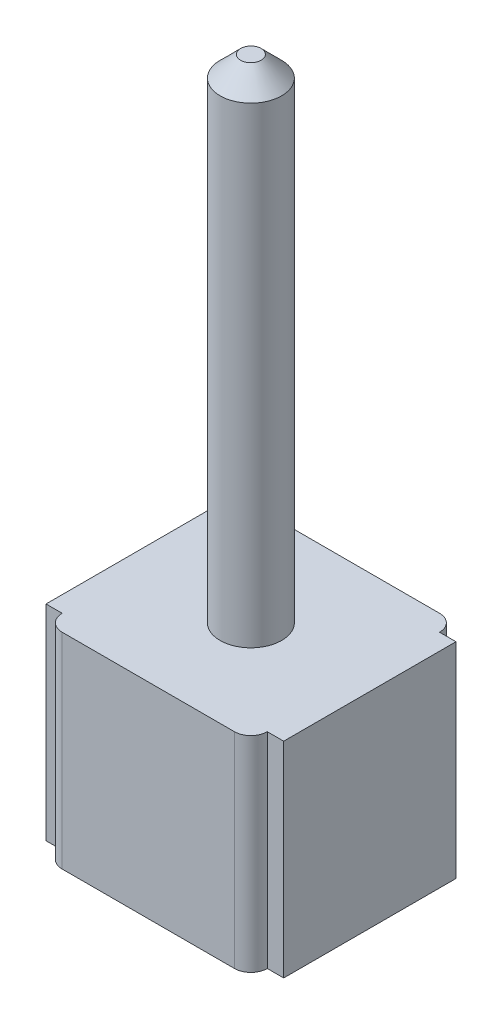
ISO-10303-21;
HEADER;
FILE_DESCRIPTION(('STEP AP214'),'2;1');
FILE_NAME('part.step','',(''),(''),'','','');
FILE_SCHEMA(('AUTOMOTIVE_DESIGN { 1 0 10303 214 1 1 1 1 }'));
ENDSEC;
DATA;
#1=APPLICATION_CONTEXT('core data for automotive mechanical design processes');
#2=APPLICATION_PROTOCOL_DEFINITION('international standard','automotive_design',2000,#1);
#3=PRODUCT_CONTEXT('',#1,'mechanical');
#4=PRODUCT('Part','Part','',(#3));
#5=PRODUCT_RELATED_PRODUCT_CATEGORY('part','',(#4));
#6=PRODUCT_DEFINITION_FORMATION('','',#4);
#7=PRODUCT_DEFINITION_CONTEXT('part definition',#1,'design');
#8=PRODUCT_DEFINITION('design','',#6,#7);
#9=PRODUCT_DEFINITION_SHAPE('','',#8);
#10=(LENGTH_UNIT() NAMED_UNIT(*) SI_UNIT(.MILLI.,.METRE.));
#11=(NAMED_UNIT(*) PLANE_ANGLE_UNIT() SI_UNIT($,.RADIAN.));
#12=(NAMED_UNIT(*) SI_UNIT($,.STERADIAN.) SOLID_ANGLE_UNIT());
#13=UNCERTAINTY_MEASURE_WITH_UNIT(LENGTH_MEASURE(1.E-05),#10,'distance_accuracy_value','');
#14=(GEOMETRIC_REPRESENTATION_CONTEXT(3) GLOBAL_UNCERTAINTY_ASSIGNED_CONTEXT((#13)) GLOBAL_UNIT_ASSIGNED_CONTEXT((#10,
#11,#12)) REPRESENTATION_CONTEXT('',''));
#15=CARTESIAN_POINT('',(0.,0.,0.));
#16=DIRECTION('',(0.,0.,1.));
#17=DIRECTION('',(1.,0.,0.));
#18=AXIS2_PLACEMENT_3D('',#15,#16,#17);
#19=CARTESIAN_POINT('',(-1.05,2.5,-1.05));
#20=DIRECTION('',(0.,-1.,0.));
#21=DIRECTION('',(0.,0.,-1.));
#22=AXIS2_PLACEMENT_3D('',#19,#20,#21);
#23=CYLINDRICAL_SURFACE('',#22,0.2);
#24=CARTESIAN_POINT('',(-1.05,0.,-1.05));
#25=DIRECTION('',(0.,1.,0.));
#26=DIRECTION('',(0.,0.,-1.));
#27=AXIS2_PLACEMENT_3D('',#24,#25,#26);
#28=CIRCLE('',#27,0.2);
#29=CARTESIAN_POINT('',(-1.05,0.,-1.25));
#30=VERTEX_POINT('',#29);
#31=CARTESIAN_POINT('',(-1.25,0.,-1.05));
#32=VERTEX_POINT('',#31);
#33=EDGE_CURVE('E213',#30,#32,#28,.T.);
#34=ORIENTED_EDGE('',*,*,#33,.T.);
#35=DIRECTION('',(0.,-1.,0.));
#36=VECTOR('',#35,1.);
#37=CARTESIAN_POINT('',(-1.25,2.5,-1.05));
#38=LINE('',#37,#36);
#39=CARTESIAN_POINT('',(-1.25,2.5,-1.05));
#40=VERTEX_POINT('',#39);
#41=EDGE_CURVE('E304',#40,#32,#38,.T.);
#42=ORIENTED_EDGE('',*,*,#41,.F.);
#43=CARTESIAN_POINT('',(-1.05,2.5,-1.05));
#44=DIRECTION('',(0.,1.,0.));
#45=DIRECTION('',(0.,0.,-1.));
#46=AXIS2_PLACEMENT_3D('',#43,#44,#45);
#47=CIRCLE('',#46,0.2);
#48=CARTESIAN_POINT('',(-1.05,2.5,-1.25));
#49=VERTEX_POINT('',#48);
#50=EDGE_CURVE('E222',#49,#40,#47,.T.);
#51=ORIENTED_EDGE('',*,*,#50,.F.);
#52=DIRECTION('',(0.,-1.,0.));
#53=VECTOR('',#52,1.);
#54=CARTESIAN_POINT('',(-1.05,2.5,-1.25));
#55=LINE('',#54,#53);
#56=EDGE_CURVE('E247',#49,#30,#55,.T.);
#57=ORIENTED_EDGE('',*,*,#56,.T.);
#58=EDGE_LOOP('',(#34,#42,#51,#57));
#59=FACE_BOUND('',#58,.T.);
#60=ADVANCED_FACE('F37',(#59),#23,.T.);
#61=CARTESIAN_POINT('',(-1.25,2.5,-1.05));
#62=DIRECTION('',(0.,0.,1.));
#63=DIRECTION('',(1.,0.,0.));
#64=AXIS2_PLACEMENT_3D('',#61,#62,#63);
#65=PLANE('',#64);
#66=DIRECTION('',(-1.,0.,0.));
#67=VECTOR('',#66,1.);
#68=CARTESIAN_POINT('',(-1.25,0.,-1.05));
#69=LINE('',#68,#67);
#70=CARTESIAN_POINT('',(-1.44693131321162,0.,-1.05));
#71=VERTEX_POINT('',#70);
#72=EDGE_CURVE('E217',#32,#71,#69,.T.);
#73=ORIENTED_EDGE('',*,*,#72,.T.);
#74=DIRECTION('',(0.,-1.,0.));
#75=VECTOR('',#74,1.);
#76=CARTESIAN_POINT('',(-1.44693131321162,2.5,-1.05));
#77=LINE('',#76,#75);
#78=CARTESIAN_POINT('',(-1.44693131321162,2.5,-1.05));
#79=VERTEX_POINT('',#78);
#80=EDGE_CURVE('E301',#79,#71,#77,.T.);
#81=ORIENTED_EDGE('',*,*,#80,.F.);
#82=DIRECTION('',(-1.,0.,0.));
#83=VECTOR('',#82,1.);
#84=CARTESIAN_POINT('',(-1.25,2.5,-1.05));
#85=LINE('',#84,#83);
#86=EDGE_CURVE('E225',#40,#79,#85,.T.);
#87=ORIENTED_EDGE('',*,*,#86,.F.);
#88=ORIENTED_EDGE('',*,*,#41,.T.);
#89=EDGE_LOOP('',(#73,#81,#87,#88));
#90=FACE_BOUND('',#89,.T.);
#91=ADVANCED_FACE('F430',(#90),#65,.F.);
#92=CARTESIAN_POINT('',(-1.44693131321162,2.5,-1.05));
#93=DIRECTION('',(1.,0.,0.));
#94=DIRECTION('',(0.,0.,-1.));
#95=AXIS2_PLACEMENT_3D('',#92,#93,#94);
#96=PLANE('',#95);
#97=DIRECTION('',(0.,0.,1.));
#98=VECTOR('',#97,1.);
#99=CARTESIAN_POINT('',(-1.44693131321162,0.,-1.05));
#100=LINE('',#99,#98);
#101=CARTESIAN_POINT('',(-1.44693131321162,0.,1.05));
#102=VERTEX_POINT('',#101);
#103=EDGE_CURVE('E250',#71,#102,#100,.T.);
#104=ORIENTED_EDGE('',*,*,#103,.T.);
#105=DIRECTION('',(0.,-1.,0.));
#106=VECTOR('',#105,1.);
#107=CARTESIAN_POINT('',(-1.44693131321162,2.5,1.05));
#108=LINE('',#107,#106);
#109=CARTESIAN_POINT('',(-1.44693131321162,2.5,1.05));
#110=VERTEX_POINT('',#109);
#111=EDGE_CURVE('E298',#110,#102,#108,.T.);
#112=ORIENTED_EDGE('',*,*,#111,.F.);
#113=DIRECTION('',(0.,0.,1.));
#114=VECTOR('',#113,1.);
#115=CARTESIAN_POINT('',(-1.44693131321162,2.5,-1.05));
#116=LINE('',#115,#114);
#117=EDGE_CURVE('E228',#79,#110,#116,.T.);
#118=ORIENTED_EDGE('',*,*,#117,.F.);
#119=ORIENTED_EDGE('',*,*,#80,.T.);
#120=EDGE_LOOP('',(#104,#112,#118,#119));
#121=FACE_BOUND('',#120,.T.);
#122=ADVANCED_FACE('F427',(#121),#96,.F.);
#123=CARTESIAN_POINT('',(-1.44693131321162,2.5,1.05));
#124=DIRECTION('',(0.,0.,-1.));
#125=DIRECTION('',(-1.,0.,0.));
#126=AXIS2_PLACEMENT_3D('',#123,#124,#125);
#127=PLANE('',#126);
#128=DIRECTION('',(1.,0.,0.));
#129=VECTOR('',#128,1.);
#130=CARTESIAN_POINT('',(-1.44693131321162,0.,1.05));
#131=LINE('',#130,#129);
#132=CARTESIAN_POINT('',(-1.25,0.,1.05));
#133=VERTEX_POINT('',#132);
#134=EDGE_CURVE('E252',#102,#133,#131,.T.);
#135=ORIENTED_EDGE('',*,*,#134,.T.);
#136=DIRECTION('',(0.,-1.,0.));
#137=VECTOR('',#136,1.);
#138=CARTESIAN_POINT('',(-1.25,2.5,1.05));
#139=LINE('',#138,#137);
#140=CARTESIAN_POINT('',(-1.25,2.5,1.05));
#141=VERTEX_POINT('',#140);
#142=EDGE_CURVE('E295',#141,#133,#139,.T.);
#143=ORIENTED_EDGE('',*,*,#142,.F.);
#144=DIRECTION('',(1.,0.,0.));
#145=VECTOR('',#144,1.);
#146=CARTESIAN_POINT('',(-1.44693131321162,2.5,1.05));
#147=LINE('',#146,#145);
#148=EDGE_CURVE('E230',#110,#141,#147,.T.);
#149=ORIENTED_EDGE('',*,*,#148,.F.);
#150=ORIENTED_EDGE('',*,*,#111,.T.);
#151=EDGE_LOOP('',(#135,#143,#149,#150));
#152=FACE_BOUND('',#151,.T.);
#153=ADVANCED_FACE('F422',(#152),#127,.F.);
#154=CARTESIAN_POINT('',(-1.05,2.5,1.05));
#155=DIRECTION('',(0.,-1.,0.));
#156=DIRECTION('',(0.,0.,-1.));
#157=AXIS2_PLACEMENT_3D('',#154,#155,#156);
#158=CYLINDRICAL_SURFACE('',#157,0.2);
#159=CARTESIAN_POINT('',(-1.05,0.,1.05));
#160=DIRECTION('',(0.,1.,0.));
#161=DIRECTION('',(0.,0.,-1.));
#162=AXIS2_PLACEMENT_3D('',#159,#160,#161);
#163=CIRCLE('',#162,0.2);
#164=CARTESIAN_POINT('',(-1.05,0.,1.25));
#165=VERTEX_POINT('',#164);
#166=EDGE_CURVE('E254',#133,#165,#163,.T.);
#167=ORIENTED_EDGE('',*,*,#166,.T.);
#168=DIRECTION('',(0.,-1.,0.));
#169=VECTOR('',#168,1.);
#170=CARTESIAN_POINT('',(-1.05,2.5,1.25));
#171=LINE('',#170,#169);
#172=CARTESIAN_POINT('',(-1.05,2.5,1.25));
#173=VERTEX_POINT('',#172);
#174=EDGE_CURVE('E292',#173,#165,#171,.T.);
#175=ORIENTED_EDGE('',*,*,#174,.F.);
#176=CARTESIAN_POINT('',(-1.05,2.5,1.05));
#177=DIRECTION('',(0.,1.,0.));
#178=DIRECTION('',(0.,0.,-1.));
#179=AXIS2_PLACEMENT_3D('',#176,#177,#178);
#180=CIRCLE('',#179,0.2);
#181=EDGE_CURVE('E232',#141,#173,#180,.T.);
#182=ORIENTED_EDGE('',*,*,#181,.F.);
#183=ORIENTED_EDGE('',*,*,#142,.T.);
#184=EDGE_LOOP('',(#167,#175,#182,#183));
#185=FACE_BOUND('',#184,.T.);
#186=ADVANCED_FACE('F417',(#185),#158,.T.);
#187=CARTESIAN_POINT('',(-1.05,2.5,1.25));
#188=DIRECTION('',(0.,0.,-1.));
#189=DIRECTION('',(-1.,0.,0.));
#190=AXIS2_PLACEMENT_3D('',#187,#188,#189);
#191=PLANE('',#190);
#192=DIRECTION('',(1.,0.,0.));
#193=VECTOR('',#192,1.);
#194=CARTESIAN_POINT('',(-1.05,0.,1.25));
#195=LINE('',#194,#193);
#196=CARTESIAN_POINT('',(1.05,0.,1.25));
#197=VERTEX_POINT('',#196);
#198=EDGE_CURVE('E256',#165,#197,#195,.T.);
#199=ORIENTED_EDGE('',*,*,#198,.T.);
#200=DIRECTION('',(0.,-1.,0.));
#201=VECTOR('',#200,1.);
#202=CARTESIAN_POINT('',(1.05,2.5,1.25));
#203=LINE('',#202,#201);
#204=CARTESIAN_POINT('',(1.05,2.5,1.25));
#205=VERTEX_POINT('',#204);
#206=EDGE_CURVE('E289',#205,#197,#203,.T.);
#207=ORIENTED_EDGE('',*,*,#206,.F.);
#208=DIRECTION('',(1.,0.,0.));
#209=VECTOR('',#208,1.);
#210=CARTESIAN_POINT('',(-1.05,2.5,1.25));
#211=LINE('',#210,#209);
#212=EDGE_CURVE('E234',#173,#205,#211,.T.);
#213=ORIENTED_EDGE('',*,*,#212,.F.);
#214=ORIENTED_EDGE('',*,*,#174,.T.);
#215=EDGE_LOOP('',(#199,#207,#213,#214));
#216=FACE_BOUND('',#215,.T.);
#217=ADVANCED_FACE('F413',(#216),#191,.F.);
#218=CARTESIAN_POINT('',(1.05,2.5,1.05));
#219=DIRECTION('',(0.,-1.,0.));
#220=DIRECTION('',(0.,0.,-1.));
#221=AXIS2_PLACEMENT_3D('',#218,#219,#220);
#222=CYLINDRICAL_SURFACE('',#221,0.2);
#223=CARTESIAN_POINT('',(1.05,0.,1.05));
#224=DIRECTION('',(0.,1.,0.));
#225=DIRECTION('',(0.,0.,1.));
#226=AXIS2_PLACEMENT_3D('',#223,#224,#225);
#227=CIRCLE('',#226,0.2);
#228=CARTESIAN_POINT('',(1.25,0.,1.05));
#229=VERTEX_POINT('',#228);
#230=EDGE_CURVE('E258',#197,#229,#227,.T.);
#231=ORIENTED_EDGE('',*,*,#230,.T.);
#232=DIRECTION('',(0.,-1.,0.));
#233=VECTOR('',#232,1.);
#234=CARTESIAN_POINT('',(1.25,2.5,1.05));
#235=LINE('',#234,#233);
#236=CARTESIAN_POINT('',(1.25,2.5,1.05));
#237=VERTEX_POINT('',#236);
#238=EDGE_CURVE('E286',#237,#229,#235,.T.);
#239=ORIENTED_EDGE('',*,*,#238,.F.);
#240=CARTESIAN_POINT('',(1.05,2.5,1.05));
#241=DIRECTION('',(0.,1.,0.));
#242=DIRECTION('',(0.,0.,1.));
#243=AXIS2_PLACEMENT_3D('',#240,#241,#242);
#244=CIRCLE('',#243,0.2);
#245=EDGE_CURVE('E236',#205,#237,#244,.T.);
#246=ORIENTED_EDGE('',*,*,#245,.F.);
#247=ORIENTED_EDGE('',*,*,#206,.T.);
#248=EDGE_LOOP('',(#231,#239,#246,#247));
#249=FACE_BOUND('',#248,.T.);
#250=ADVANCED_FACE('F408',(#249),#222,.T.);
#251=CARTESIAN_POINT('',(1.44996260874723,2.5,1.05));
#252=DIRECTION('',(0.,0.,-1.));
#253=DIRECTION('',(-1.,0.,0.));
#254=AXIS2_PLACEMENT_3D('',#251,#252,#253);
#255=PLANE('',#254);
#256=DIRECTION('',(1.,0.,0.));
#257=VECTOR('',#256,1.);
#258=CARTESIAN_POINT('',(1.44996260874723,0.,1.05));
#259=LINE('',#258,#257);
#260=CARTESIAN_POINT('',(1.44996260874723,0.,1.05));
#261=VERTEX_POINT('',#260);
#262=EDGE_CURVE('E260',#229,#261,#259,.T.);
#263=ORIENTED_EDGE('',*,*,#262,.T.);
#264=DIRECTION('',(0.,-1.,0.));
#265=VECTOR('',#264,1.);
#266=CARTESIAN_POINT('',(1.44996260874723,2.5,1.05));
#267=LINE('',#266,#265);
#268=CARTESIAN_POINT('',(1.44996260874723,2.5,1.05));
#269=VERTEX_POINT('',#268);
#270=EDGE_CURVE('E283',#269,#261,#267,.T.);
#271=ORIENTED_EDGE('',*,*,#270,.F.);
#272=DIRECTION('',(1.,0.,0.));
#273=VECTOR('',#272,1.);
#274=CARTESIAN_POINT('',(1.44996260874723,2.5,1.05));
#275=LINE('',#274,#273);
#276=EDGE_CURVE('E238',#237,#269,#275,.T.);
#277=ORIENTED_EDGE('',*,*,#276,.F.);
#278=ORIENTED_EDGE('',*,*,#238,.T.);
#279=EDGE_LOOP('',(#263,#271,#277,#278));
#280=FACE_BOUND('',#279,.T.);
#281=ADVANCED_FACE('F402',(#280),#255,.F.);
#282=CARTESIAN_POINT('',(1.44996260874723,2.5,-1.05));
#283=DIRECTION('',(-1.,0.,0.));
#284=DIRECTION('',(0.,0.,1.));
#285=AXIS2_PLACEMENT_3D('',#282,#283,#284);
#286=PLANE('',#285);
#287=DIRECTION('',(0.,0.,-1.));
#288=VECTOR('',#287,1.);
#289=CARTESIAN_POINT('',(1.44996260874723,0.,-1.05));
#290=LINE('',#289,#288);
#291=CARTESIAN_POINT('',(1.44996260874723,0.,-1.05));
#292=VERTEX_POINT('',#291);
#293=EDGE_CURVE('E262',#261,#292,#290,.T.);
#294=ORIENTED_EDGE('',*,*,#293,.T.);
#295=DIRECTION('',(0.,-1.,0.));
#296=VECTOR('',#295,1.);
#297=CARTESIAN_POINT('',(1.44996260874723,2.5,-1.05));
#298=LINE('',#297,#296);
#299=CARTESIAN_POINT('',(1.44996260874723,2.5,-1.05));
#300=VERTEX_POINT('',#299);
#301=EDGE_CURVE('E280',#300,#292,#298,.T.);
#302=ORIENTED_EDGE('',*,*,#301,.F.);
#303=DIRECTION('',(0.,0.,-1.));
#304=VECTOR('',#303,1.);
#305=CARTESIAN_POINT('',(1.44996260874723,2.5,-1.05));
#306=LINE('',#305,#304);
#307=EDGE_CURVE('E240',#269,#300,#306,.T.);
#308=ORIENTED_EDGE('',*,*,#307,.F.);
#309=ORIENTED_EDGE('',*,*,#270,.T.);
#310=EDGE_LOOP('',(#294,#302,#308,#309));
#311=FACE_BOUND('',#310,.T.);
#312=ADVANCED_FACE('F398',(#311),#286,.F.);
#313=CARTESIAN_POINT('',(1.25,2.5,-1.05));
#314=DIRECTION('',(0.,0.,1.));
#315=DIRECTION('',(1.,0.,0.));
#316=AXIS2_PLACEMENT_3D('',#313,#314,#315);
#317=PLANE('',#316);
#318=DIRECTION('',(-1.,0.,0.));
#319=VECTOR('',#318,1.);
#320=CARTESIAN_POINT('',(1.25,0.,-1.05));
#321=LINE('',#320,#319);
#322=CARTESIAN_POINT('',(1.25,0.,-1.05));
#323=VERTEX_POINT('',#322);
#324=EDGE_CURVE('E264',#292,#323,#321,.T.);
#325=ORIENTED_EDGE('',*,*,#324,.T.);
#326=DIRECTION('',(0.,-1.,0.));
#327=VECTOR('',#326,1.);
#328=CARTESIAN_POINT('',(1.25,2.5,-1.05));
#329=LINE('',#328,#327);
#330=CARTESIAN_POINT('',(1.25,2.5,-1.05));
#331=VERTEX_POINT('',#330);
#332=EDGE_CURVE('E277',#331,#323,#329,.T.);
#333=ORIENTED_EDGE('',*,*,#332,.F.);
#334=DIRECTION('',(-1.,0.,0.));
#335=VECTOR('',#334,1.);
#336=CARTESIAN_POINT('',(1.25,2.5,-1.05));
#337=LINE('',#336,#335);
#338=EDGE_CURVE('E242',#300,#331,#337,.T.);
#339=ORIENTED_EDGE('',*,*,#338,.F.);
#340=ORIENTED_EDGE('',*,*,#301,.T.);
#341=EDGE_LOOP('',(#325,#333,#339,#340));
#342=FACE_BOUND('',#341,.T.);
#343=ADVANCED_FACE('F393',(#342),#317,.F.);
#344=CARTESIAN_POINT('',(1.05,2.5,-1.05));
#345=DIRECTION('',(0.,-1.,0.));
#346=DIRECTION('',(0.,0.,-1.));
#347=AXIS2_PLACEMENT_3D('',#344,#345,#346);
#348=CYLINDRICAL_SURFACE('',#347,0.2);
#349=CARTESIAN_POINT('',(1.05,0.,-1.05));
#350=DIRECTION('',(0.,1.,0.));
#351=DIRECTION('',(0.,0.,-1.));
#352=AXIS2_PLACEMENT_3D('',#349,#350,#351);
#353=CIRCLE('',#352,0.2);
#354=CARTESIAN_POINT('',(1.05,0.,-1.25));
#355=VERTEX_POINT('',#354);
#356=EDGE_CURVE('E266',#323,#355,#353,.T.);
#357=ORIENTED_EDGE('',*,*,#356,.T.);
#358=DIRECTION('',(0.,-1.,0.));
#359=VECTOR('',#358,1.);
#360=CARTESIAN_POINT('',(1.05,2.5,-1.25));
#361=LINE('',#360,#359);
#362=CARTESIAN_POINT('',(1.05,2.5,-1.25));
#363=VERTEX_POINT('',#362);
#364=EDGE_CURVE('E274',#363,#355,#361,.T.);
#365=ORIENTED_EDGE('',*,*,#364,.F.);
#366=CARTESIAN_POINT('',(1.05,2.5,-1.05));
#367=DIRECTION('',(0.,1.,0.));
#368=DIRECTION('',(0.,0.,-1.));
#369=AXIS2_PLACEMENT_3D('',#366,#367,#368);
#370=CIRCLE('',#369,0.2);
#371=EDGE_CURVE('E244',#331,#363,#370,.T.);
#372=ORIENTED_EDGE('',*,*,#371,.F.);
#373=ORIENTED_EDGE('',*,*,#332,.T.);
#374=EDGE_LOOP('',(#357,#365,#372,#373));
#375=FACE_BOUND('',#374,.T.);
#376=ADVANCED_FACE('F387',(#375),#348,.T.);
#377=CARTESIAN_POINT('',(-1.05,2.5,-1.25));
#378=DIRECTION('',(0.,0.,1.));
#379=DIRECTION('',(1.,0.,0.));
#380=AXIS2_PLACEMENT_3D('',#377,#378,#379);
#381=PLANE('',#380);
#382=DIRECTION('',(-1.,0.,0.));
#383=VECTOR('',#382,1.);
#384=CARTESIAN_POINT('',(-1.05,0.,-1.25));
#385=LINE('',#384,#383);
#386=CARTESIAN_POINT('',(0.304241831659743,0.,-1.25));
#387=VERTEX_POINT('',#386);
#388=EDGE_CURVE('E226',#355,#387,#385,.T.);
#389=ORIENTED_EDGE('',*,*,#388,.T.);
#390=DIRECTION('',(0.,1.,0.));
#391=VECTOR('',#390,1.);
#392=CARTESIAN_POINT('',(0.304241831659743,-0.2,-1.25));
#393=LINE('',#392,#391);
#394=CARTESIAN_POINT('',(0.304241831659743,-0.15,-1.25));
#395=VERTEX_POINT('',#394);
#396=EDGE_CURVE('E335',#395,#387,#393,.T.);
#397=ORIENTED_EDGE('',*,*,#396,.F.);
#398=CARTESIAN_POINT('',(0.154241831659743,-0.15,-1.25));
#399=DIRECTION('',(0.,0.,1.));
#400=DIRECTION('',(1.,0.,0.));
#401=AXIS2_PLACEMENT_3D('',#398,#399,#400);
#402=CIRCLE('',#401,0.15);
#403=CARTESIAN_POINT('',(0.154241831659743,0.,-1.25));
#404=VERTEX_POINT('',#403);
#405=EDGE_CURVE('E11',#395,#404,#402,.T.);
#406=ORIENTED_EDGE('',*,*,#405,.T.);
#407=CARTESIAN_POINT('',(-0.149312937150452,0.,-1.25));
#408=VERTEX_POINT('',#407);
#409=EDGE_CURVE('E271',#404,#408,#385,.T.);
#410=ORIENTED_EDGE('',*,*,#409,.T.);
#411=CARTESIAN_POINT('',(-0.149312937150452,-0.15,-1.25));
#412=DIRECTION('',(0.,0.,1.));
#413=DIRECTION('',(1.,0.,0.));
#414=AXIS2_PLACEMENT_3D('',#411,#412,#413);
#415=CIRCLE('',#414,0.15);
#416=CARTESIAN_POINT('',(-0.299312937150452,-0.15,-1.25));
#417=VERTEX_POINT('',#416);
#418=EDGE_CURVE('E46',#408,#417,#415,.T.);
#419=ORIENTED_EDGE('',*,*,#418,.T.);
#420=DIRECTION('',(0.,-1.,0.));
#421=VECTOR('',#420,1.);
#422=CARTESIAN_POINT('',(-0.299312937150452,-0.2,-1.25));
#423=LINE('',#422,#421);
#424=CARTESIAN_POINT('',(-0.299312937150452,0.,-1.25));
#425=VERTEX_POINT('',#424);
#426=EDGE_CURVE('E54',#425,#417,#423,.T.);
#427=ORIENTED_EDGE('',*,*,#426,.F.);
#428=EDGE_CURVE('E268',#425,#30,#385,.T.);
#429=ORIENTED_EDGE('',*,*,#428,.T.);
#430=ORIENTED_EDGE('',*,*,#56,.F.);
#431=DIRECTION('',(-1.,0.,0.));
#432=VECTOR('',#431,1.);
#433=CARTESIAN_POINT('',(-1.05,2.5,-1.25));
#434=LINE('',#433,#432);
#435=EDGE_CURVE('E246',#363,#49,#434,.T.);
#436=ORIENTED_EDGE('',*,*,#435,.F.);
#437=ORIENTED_EDGE('',*,*,#364,.T.);
#438=EDGE_LOOP('',(#389,#397,#406,#410,#419,#427,#429,#430,#436,#437));
#439=FACE_BOUND('',#438,.T.);
#440=ADVANCED_FACE('F381',(#439),#381,.F.);
#441=CARTESIAN_POINT('',(-1.05,2.5,-1.05));
#442=DIRECTION('',(0.,-1.,0.));
#443=DIRECTION('',(0.,0.,-1.));
#444=AXIS2_PLACEMENT_3D('',#441,#442,#443);
#445=PLANE('',#444);
#446=CARTESIAN_POINT('',(0.,2.5,0.));
#447=DIRECTION('',(0.,-1.,0.));
#448=DIRECTION('',(0.,0.,-1.));
#449=AXIS2_PLACEMENT_3D('',#446,#447,#448);
#450=CIRCLE('',#449,0.375);
#451=CARTESIAN_POINT('',(0.,2.5,-0.375));
#452=VERTEX_POINT('',#451);
#453=EDGE_CURVE('E307',#452,#452,#450,.F.);
#454=ORIENTED_EDGE('',*,*,#453,.F.);
#455=EDGE_LOOP('',(#454));
#456=FACE_BOUND('',#455,.T.);
#457=ORIENTED_EDGE('',*,*,#50,.T.);
#458=ORIENTED_EDGE('',*,*,#86,.T.);
#459=ORIENTED_EDGE('',*,*,#117,.T.);
#460=ORIENTED_EDGE('',*,*,#148,.T.);
#461=ORIENTED_EDGE('',*,*,#181,.T.);
#462=ORIENTED_EDGE('',*,*,#212,.T.);
#463=ORIENTED_EDGE('',*,*,#245,.T.);
#464=ORIENTED_EDGE('',*,*,#276,.T.);
#465=ORIENTED_EDGE('',*,*,#307,.T.);
#466=ORIENTED_EDGE('',*,*,#338,.T.);
#467=ORIENTED_EDGE('',*,*,#371,.T.);
#468=ORIENTED_EDGE('',*,*,#435,.T.);
#469=EDGE_LOOP('',(#457,#458,#459,#460,#461,#462,#463,#464,#465,#466,#467,#468));
#470=FACE_BOUND('',#469,.T.);
#471=ADVANCED_FACE('F587',(#456,#470),#445,.F.);
#472=CARTESIAN_POINT('',(-1.05,0.,-1.05));
#473=DIRECTION('',(0.,-1.,0.));
#474=DIRECTION('',(0.,0.,-1.));
#475=AXIS2_PLACEMENT_3D('',#472,#473,#474);
#476=PLANE('',#475);
#477=DIRECTION('',(0.,0.,-1.));
#478=VECTOR('',#477,1.);
#479=CARTESIAN_POINT('',(-0.299312937150452,0.,0.));
#480=LINE('',#479,#478);
#481=CARTESIAN_POINT('',(-0.299312937150452,0.,0.));
#482=VERTEX_POINT('',#481);
#483=EDGE_CURVE('E353',#482,#425,#480,.T.);
#484=ORIENTED_EDGE('',*,*,#483,.F.);
#485=DIRECTION('',(-1.,0.,0.));
#486=VECTOR('',#485,1.);
#487=CARTESIAN_POINT('',(0.,0.,0.));
#488=LINE('',#487,#486);
#489=CARTESIAN_POINT('',(0.304241831659743,0.,0.));
#490=VERTEX_POINT('',#489);
#491=EDGE_CURVE('E209',#490,#482,#488,.T.);
#492=ORIENTED_EDGE('',*,*,#491,.F.);
#493=DIRECTION('',(0.,0.,1.));
#494=VECTOR('',#493,1.);
#495=CARTESIAN_POINT('',(0.304241831659743,0.,0.));
#496=LINE('',#495,#494);
#497=EDGE_CURVE('E316',#387,#490,#496,.T.);
#498=ORIENTED_EDGE('',*,*,#497,.F.);
#499=ORIENTED_EDGE('',*,*,#388,.F.);
#500=ORIENTED_EDGE('',*,*,#356,.F.);
#501=ORIENTED_EDGE('',*,*,#324,.F.);
#502=ORIENTED_EDGE('',*,*,#293,.F.);
#503=ORIENTED_EDGE('',*,*,#262,.F.);
#504=ORIENTED_EDGE('',*,*,#230,.F.);
#505=ORIENTED_EDGE('',*,*,#198,.F.);
#506=ORIENTED_EDGE('',*,*,#166,.F.);
#507=ORIENTED_EDGE('',*,*,#134,.F.);
#508=ORIENTED_EDGE('',*,*,#103,.F.);
#509=ORIENTED_EDGE('',*,*,#72,.F.);
#510=ORIENTED_EDGE('',*,*,#33,.F.);
#511=ORIENTED_EDGE('',*,*,#428,.F.);
#512=EDGE_LOOP('',(#484,#492,#498,#499,#500,#501,#502,#503,#504,#505,#506,#507,#508,#509,#510,#511));
#513=FACE_BOUND('',#512,.T.);
#514=ADVANCED_FACE('F379',(#513),#476,.T.);
#515=CARTESIAN_POINT('',(0.,8.5,0.));
#516=DIRECTION('',(0.,-1.,0.));
#517=DIRECTION('',(0.,0.,-1.));
#518=AXIS2_PLACEMENT_3D('',#515,#516,#517);
#519=CYLINDRICAL_SURFACE('',#518,0.375);
#520=CARTESIAN_POINT('',(0.,8.25,0.));
#521=DIRECTION('',(0.,1.,0.));
#522=DIRECTION('',(0.,0.,1.));
#523=AXIS2_PLACEMENT_3D('',#520,#521,#522);
#524=CIRCLE('',#523,0.375);
#525=CARTESIAN_POINT('',(0.,8.25,-0.375000000000001));
#526=VERTEX_POINT('',#525);
#527=EDGE_CURVE('E313',#526,#526,#524,.F.);
#528=ORIENTED_EDGE('',*,*,#527,.T.);
#529=EDGE_LOOP('',(#528));
#530=FACE_BOUND('',#529,.T.);
#531=ORIENTED_EDGE('',*,*,#453,.T.);
#532=EDGE_LOOP('',(#531));
#533=FACE_BOUND('',#532,.T.);
#534=ADVANCED_FACE('F627',(#530,#533),#519,.T.);
#535=CARTESIAN_POINT('',(0.,8.5,0.));
#536=DIRECTION('',(0.,1.,0.));
#537=DIRECTION('',(0.,0.,1.));
#538=AXIS2_PLACEMENT_3D('',#535,#536,#537);
#539=PLANE('',#538);
#540=CARTESIAN_POINT('',(0.,8.5,0.));
#541=DIRECTION('',(0.,1.,0.));
#542=DIRECTION('',(0.,0.,1.));
#543=AXIS2_PLACEMENT_3D('',#540,#541,#542);
#544=CIRCLE('',#543,0.124999999999998);
#545=CARTESIAN_POINT('',(0.,8.5,-0.124999999999999));
#546=VERTEX_POINT('',#545);
#547=EDGE_CURVE('E310',#546,#546,#544,.T.);
#548=ORIENTED_EDGE('',*,*,#547,.T.);
#549=EDGE_LOOP('',(#548));
#550=FACE_BOUND('',#549,.T.);
#551=ADVANCED_FACE('F477',(#550),#539,.T.);
#552=CARTESIAN_POINT('',(0.,8.5,0.));
#553=DIRECTION('',(0.,-1.,0.));
#554=DIRECTION('',(0.,0.,-1.));
#555=AXIS2_PLACEMENT_3D('',#552,#553,#554);
#556=CONICAL_SURFACE('',#555,0.124999999999998,0.785398163397448);
#557=CARTESIAN_POINT('',(0.,8.25,-0.375000000000001));
#558=CARTESIAN_POINT('',(0.,8.25260416666666,-0.372395833333334));
#559=CARTESIAN_POINT('',(0.,8.25520833333333,-0.369791666666667));
#560=CARTESIAN_POINT('',(0.,8.26041666666666,-0.364583333333334));
#561=CARTESIAN_POINT('',(0.,8.26302083333333,-0.361979166666668));
#562=CARTESIAN_POINT('',(0.,8.26822916666666,-0.356770833333334));
#563=CARTESIAN_POINT('',(0.,8.27083333333333,-0.354166666666667));
#564=CARTESIAN_POINT('',(0.,8.27604166666666,-0.348958333333334));
#565=CARTESIAN_POINT('',(0.,8.27864583333333,-0.346354166666668));
#566=CARTESIAN_POINT('',(0.,8.28385416666666,-0.341145833333334));
#567=CARTESIAN_POINT('',(0.,8.28645833333333,-0.338541666666667));
#568=CARTESIAN_POINT('',(0.,8.29166666666666,-0.333333333333334));
#569=CARTESIAN_POINT('',(0.,8.29427083333333,-0.330729166666667));
#570=CARTESIAN_POINT('',(0.,8.29947916666666,-0.325520833333334));
#571=CARTESIAN_POINT('',(0.,8.30208333333333,-0.322916666666667));
#572=CARTESIAN_POINT('',(0.,8.30729166666666,-0.317708333333334));
#573=CARTESIAN_POINT('',(0.,8.30989583333333,-0.315104166666667));
#574=CARTESIAN_POINT('',(0.,8.31510416666666,-0.309895833333334));
#575=CARTESIAN_POINT('',(0.,8.31770833333333,-0.307291666666667));
#576=CARTESIAN_POINT('',(0.,8.32291666666666,-0.302083333333334));
#577=CARTESIAN_POINT('',(0.,8.32552083333333,-0.299479166666667));
#578=CARTESIAN_POINT('',(0.,8.33072916666666,-0.294270833333334));
#579=CARTESIAN_POINT('',(0.,8.33333333333333,-0.291666666666667));
#580=CARTESIAN_POINT('',(0.,8.33854166666666,-0.286458333333334));
#581=CARTESIAN_POINT('',(0.,8.34114583333333,-0.283854166666667));
#582=CARTESIAN_POINT('',(0.,8.34635416666666,-0.278645833333334));
#583=CARTESIAN_POINT('',(0.,8.34895833333333,-0.276041666666667));
#584=CARTESIAN_POINT('',(0.,8.35416666666666,-0.270833333333333));
#585=CARTESIAN_POINT('',(0.,8.35677083333333,-0.268229166666667));
#586=CARTESIAN_POINT('',(0.,8.36197916666666,-0.263020833333334));
#587=CARTESIAN_POINT('',(0.,8.36458333333333,-0.260416666666667));
#588=CARTESIAN_POINT('',(0.,8.36979166666666,-0.255208333333333));
#589=CARTESIAN_POINT('',(0.,8.37239583333333,-0.252604166666667));
#590=CARTESIAN_POINT('',(0.,8.37760416666666,-0.247395833333334));
#591=CARTESIAN_POINT('',(0.,8.38020833333333,-0.244791666666667));
#592=CARTESIAN_POINT('',(0.,8.38541666666667,-0.239583333333333));
#593=CARTESIAN_POINT('',(0.,8.38802083333333,-0.236979166666667));
#594=CARTESIAN_POINT('',(0.,8.39322916666666,-0.231770833333333));
#595=CARTESIAN_POINT('',(0.,8.39583333333333,-0.229166666666667));
#596=CARTESIAN_POINT('',(0.,8.40104166666667,-0.223958333333333));
#597=CARTESIAN_POINT('',(0.,8.40364583333333,-0.221354166666666));
#598=CARTESIAN_POINT('',(0.,8.40885416666666,-0.216145833333333));
#599=CARTESIAN_POINT('',(0.,8.41145833333333,-0.213541666666667));
#600=CARTESIAN_POINT('',(0.,8.41666666666667,-0.208333333333333));
#601=CARTESIAN_POINT('',(0.,8.41927083333333,-0.205729166666666));
#602=CARTESIAN_POINT('',(0.,8.42447916666666,-0.200520833333333));
#603=CARTESIAN_POINT('',(0.,8.42708333333333,-0.197916666666667));
#604=CARTESIAN_POINT('',(0.,8.43229166666667,-0.192708333333333));
#605=CARTESIAN_POINT('',(0.,8.43489583333333,-0.190104166666666));
#606=CARTESIAN_POINT('',(0.,8.44010416666667,-0.184895833333333));
#607=CARTESIAN_POINT('',(0.,8.44270833333333,-0.182291666666666));
#608=CARTESIAN_POINT('',(0.,8.44791666666667,-0.177083333333333));
#609=CARTESIAN_POINT('',(0.,8.45052083333333,-0.174479166666666));
#610=CARTESIAN_POINT('',(0.,8.45572916666667,-0.169270833333333));
#611=CARTESIAN_POINT('',(0.,8.45833333333333,-0.166666666666666));
#612=CARTESIAN_POINT('',(0.,8.46354166666667,-0.161458333333333));
#613=CARTESIAN_POINT('',(0.,8.46614583333333,-0.158854166666666));
#614=CARTESIAN_POINT('',(0.,8.47135416666667,-0.153645833333333));
#615=CARTESIAN_POINT('',(0.,8.47395833333333,-0.151041666666666));
#616=CARTESIAN_POINT('',(0.,8.47916666666667,-0.145833333333333));
#617=CARTESIAN_POINT('',(0.,8.48177083333333,-0.143229166666666));
#618=CARTESIAN_POINT('',(0.,8.48697916666667,-0.138020833333332));
#619=CARTESIAN_POINT('',(0.,8.48958333333333,-0.135416666666666));
#620=CARTESIAN_POINT('',(0.,8.49479166666667,-0.130208333333333));
#621=CARTESIAN_POINT('',(0.,8.49739583333333,-0.127604166666666));
#622=CARTESIAN_POINT('',(0.,8.5,-0.124999999999999));
#623=B_SPLINE_CURVE_WITH_KNOTS('',3,(#557,#558,#559,#560,#561,#562,#563,#564,#565,#566,#567,
#568,#569,#570,#571,#572,#573,#574,#575,#576,#577,#578,#579,#580,#581,#582,#583,#584,#585,#586,
#587,#588,#589,#590,#591,#592,#593,#594,#595,#596,#597,#598,#599,#600,#601,#602,#603,#604,#605,
#606,#607,#608,#609,#610,#611,#612,#613,#614,#615,#616,#617,#618,#619,#620,#621,#622),
.UNSPECIFIED.,.F.,.F.,(4,2,2,2,2,2,2,2,2,2,2,2,2,2,2,2,2,2,2,2,2,2,2,2,2,2,2,2,2,2,2,2,4),(0.,
0.0110485434560405,0.0220970869120809,0.0331456303681202,0.0441941738241606,0.0552427172801999,
0.0662912607362403,0.0773398041922795,0.08838834764832,0.0994368911043592,0.1104854345604,
0.121533978016439,0.132582521472479,0.143631064928519,0.154679608384559,0.165728151840598,
0.176776695296639,0.187825238752679,0.198873782208718,0.209922325664759,0.220970869120798,
0.232019412576839,0.243067956032878,0.254116499488918,0.265165042944958,0.276213586400998,
0.287262129857037,0.298310673313078,0.309359216769117,0.320407760225157,0.331456303681197,
0.342504847137237,0.353553390593278),.UNSPECIFIED.);
#624=EDGE_CURVE('BSEAM474',#526,#546,#623,.T.);
#625=ORIENTED_EDGE('',*,*,#527,.F.);
#626=ORIENTED_EDGE('',*,*,#547,.F.);
#627=ORIENTED_EDGE('',*,*,#624,.T.);
#628=ORIENTED_EDGE('',*,*,#624,.F.);
#629=EDGE_LOOP('',(#625,#627,#626,#628));
#630=FACE_BOUND('',#629,.T.);
#631=ADVANCED_FACE('F474',(#630),#556,.T.);
#632=CARTESIAN_POINT('',(-0.299312937150452,-0.2,0.));
#633=DIRECTION('',(1.,0.,0.));
#634=DIRECTION('',(0.,0.,-1.));
#635=AXIS2_PLACEMENT_3D('',#632,#633,#634);
#636=PLANE('',#635);
#637=ORIENTED_EDGE('',*,*,#483,.T.);
#638=ORIENTED_EDGE('',*,*,#426,.T.);
#639=DIRECTION('',(0.,0.,-1.));
#640=VECTOR('',#639,1.);
#641=CARTESIAN_POINT('',(-0.299312937150452,-0.15,0.));
#642=LINE('',#641,#640);
#643=CARTESIAN_POINT('',(-0.299312937150452,-0.15,-2.10093843775677));
#644=VERTEX_POINT('',#643);
#645=EDGE_CURVE('E323',#417,#644,#642,.T.);
#646=ORIENTED_EDGE('',*,*,#645,.T.);
#647=DIRECTION('',(0.,1.,0.));
#648=VECTOR('',#647,1.);
#649=CARTESIAN_POINT('',(-0.299312937150452,-0.2,-2.10093843775677));
#650=LINE('',#649,#648);
#651=CARTESIAN_POINT('',(-0.299312937150452,-0.2,-2.10093843775677));
#652=VERTEX_POINT('',#651);
#653=EDGE_CURVE('E196',#644,#652,#650,.F.);
#654=ORIENTED_EDGE('',*,*,#653,.T.);
#655=DIRECTION('',(0.,0.,-1.));
#656=VECTOR('',#655,1.);
#657=CARTESIAN_POINT('',(-0.299312937150452,-0.2,0.));
#658=LINE('',#657,#656);
#659=CARTESIAN_POINT('',(-0.299312937150452,-0.2,0.));
#660=VERTEX_POINT('',#659);
#661=EDGE_CURVE('E189',#660,#652,#658,.T.);
#662=ORIENTED_EDGE('',*,*,#661,.F.);
#663=DIRECTION('',(0.,1.,0.));
#664=VECTOR('',#663,1.);
#665=CARTESIAN_POINT('',(-0.299312937150452,-0.2,0.));
#666=LINE('',#665,#664);
#667=EDGE_CURVE('E193',#660,#482,#666,.T.);
#668=ORIENTED_EDGE('',*,*,#667,.T.);
#669=EDGE_LOOP('',(#637,#638,#646,#654,#662,#668));
#670=FACE_BOUND('',#669,.T.);
#671=ADVANCED_FACE('F191',(#670),#636,.F.);
#672=CARTESIAN_POINT('',(0.,-0.2,-2.25093843775677));
#673=DIRECTION('',(0.,0.,1.));
#674=DIRECTION('',(1.,0.,0.));
#675=AXIS2_PLACEMENT_3D('',#672,#673,#674);
#676=PLANE('',#675);
#677=DIRECTION('',(1.,0.,0.));
#678=VECTOR('',#677,1.);
#679=CARTESIAN_POINT('',(0.,-0.2,-2.25093843775677));
#680=LINE('',#679,#678);
#681=CARTESIAN_POINT('',(-0.149312937150452,-0.2,-2.25093843775677));
#682=VERTEX_POINT('',#681);
#683=CARTESIAN_POINT('',(0.154241831659743,-0.2,-2.25093843775677));
#684=VERTEX_POINT('',#683);
#685=EDGE_CURVE('E199',#682,#684,#680,.T.);
#686=ORIENTED_EDGE('',*,*,#685,.F.);
#687=DIRECTION('',(0.,1.,0.));
#688=VECTOR('',#687,1.);
#689=CARTESIAN_POINT('',(-0.149312937150452,-0.2,-2.25093843775677));
#690=LINE('',#689,#688);
#691=CARTESIAN_POINT('',(-0.149312937150452,-0.15,-2.25093843775677));
#692=VERTEX_POINT('',#691);
#693=EDGE_CURVE('E342',#682,#692,#690,.T.);
#694=ORIENTED_EDGE('',*,*,#693,.T.);
#695=DIRECTION('',(1.,0.,0.));
#696=VECTOR('',#695,1.);
#697=CARTESIAN_POINT('',(0.,-0.15,-2.25093843775677));
#698=LINE('',#697,#696);
#699=CARTESIAN_POINT('',(0.154241831659743,-0.15,-2.25093843775677));
#700=VERTEX_POINT('',#699);
#701=EDGE_CURVE('E317',#692,#700,#698,.T.);
#702=ORIENTED_EDGE('',*,*,#701,.T.);
#703=DIRECTION('',(0.,1.,0.));
#704=VECTOR('',#703,1.);
#705=CARTESIAN_POINT('',(0.154241831659743,-0.2,-2.25093843775677));
#706=LINE('',#705,#704);
#707=EDGE_CURVE('E62',#700,#684,#706,.F.);
#708=ORIENTED_EDGE('',*,*,#707,.T.);
#709=EDGE_LOOP('',(#686,#694,#702,#708));
#710=FACE_BOUND('',#709,.T.);
#711=ADVANCED_FACE('F452',(#710),#676,.F.);
#712=CARTESIAN_POINT('',(0.304241831659743,-0.2,0.));
#713=DIRECTION('',(-1.,0.,0.));
#714=DIRECTION('',(0.,0.,1.));
#715=AXIS2_PLACEMENT_3D('',#712,#713,#714);
#716=PLANE('',#715);
#717=DIRECTION('',(0.,0.,1.));
#718=VECTOR('',#717,1.);
#719=CARTESIAN_POINT('',(0.304241831659743,-0.15,0.));
#720=LINE('',#719,#718);
#721=CARTESIAN_POINT('',(0.304241831659743,-0.15,-2.10093843775677));
#722=VERTEX_POINT('',#721);
#723=EDGE_CURVE('E332',#722,#395,#720,.T.);
#724=ORIENTED_EDGE('',*,*,#723,.T.);
#725=ORIENTED_EDGE('',*,*,#396,.T.);
#726=ORIENTED_EDGE('',*,*,#497,.T.);
#727=DIRECTION('',(0.,1.,0.));
#728=VECTOR('',#727,1.);
#729=CARTESIAN_POINT('',(0.304241831659743,-0.2,0.));
#730=LINE('',#729,#728);
#731=CARTESIAN_POINT('',(0.304241831659743,-0.2,0.));
#732=VERTEX_POINT('',#731);
#733=EDGE_CURVE('E214',#732,#490,#730,.T.);
#734=ORIENTED_EDGE('',*,*,#733,.F.);
#735=DIRECTION('',(0.,0.,1.));
#736=VECTOR('',#735,1.);
#737=CARTESIAN_POINT('',(0.304241831659743,-0.2,0.));
#738=LINE('',#737,#736);
#739=CARTESIAN_POINT('',(0.304241831659743,-0.2,-2.10093843775677));
#740=VERTEX_POINT('',#739);
#741=EDGE_CURVE('E205',#740,#732,#738,.T.);
#742=ORIENTED_EDGE('',*,*,#741,.F.);
#743=DIRECTION('',(0.,1.,0.));
#744=VECTOR('',#743,1.);
#745=CARTESIAN_POINT('',(0.304241831659743,-0.2,-2.10093843775677));
#746=LINE('',#745,#744);
#747=EDGE_CURVE('E330',#740,#722,#746,.T.);
#748=ORIENTED_EDGE('',*,*,#747,.T.);
#749=EDGE_LOOP('',(#724,#725,#726,#734,#742,#748));
#750=FACE_BOUND('',#749,.T.);
#751=ADVANCED_FACE('F369',(#750),#716,.F.);
#752=CARTESIAN_POINT('',(0.,-0.2,0.));
#753=DIRECTION('',(0.,0.,-1.));
#754=DIRECTION('',(-1.,0.,0.));
#755=AXIS2_PLACEMENT_3D('',#752,#753,#754);
#756=PLANE('',#755);
#757=ORIENTED_EDGE('',*,*,#491,.T.);
#758=ORIENTED_EDGE('',*,*,#667,.F.);
#759=DIRECTION('',(-1.,0.,0.));
#760=VECTOR('',#759,1.);
#761=CARTESIAN_POINT('',(0.,-0.2,0.));
#762=LINE('',#761,#760);
#763=EDGE_CURVE('E200',#732,#660,#762,.T.);
#764=ORIENTED_EDGE('',*,*,#763,.F.);
#765=ORIENTED_EDGE('',*,*,#733,.T.);
#766=EDGE_LOOP('',(#757,#758,#764,#765));
#767=FACE_BOUND('',#766,.T.);
#768=ADVANCED_FACE('F212',(#767),#756,.F.);
#769=CARTESIAN_POINT('',(0.,-0.2,0.));
#770=DIRECTION('',(0.,-1.,0.));
#771=DIRECTION('',(0.,0.,-1.));
#772=AXIS2_PLACEMENT_3D('',#769,#770,#771);
#773=PLANE('',#772);
#774=ORIENTED_EDGE('',*,*,#661,.T.);
#775=CARTESIAN_POINT('',(-0.149312937150452,-0.2,-2.10093843775677));
#776=DIRECTION('',(0.,-1.,0.));
#777=DIRECTION('',(0.,0.,-1.));
#778=AXIS2_PLACEMENT_3D('',#775,#776,#777);
#779=CIRCLE('',#778,0.15);
#780=EDGE_CURVE('E346',#652,#682,#779,.T.);
#781=ORIENTED_EDGE('',*,*,#780,.T.);
#782=ORIENTED_EDGE('',*,*,#685,.T.);
#783=CARTESIAN_POINT('',(0.154241831659743,-0.2,-2.10093843775677));
#784=DIRECTION('',(0.,-1.,0.));
#785=DIRECTION('',(0.,0.,-1.));
#786=AXIS2_PLACEMENT_3D('',#783,#784,#785);
#787=CIRCLE('',#786,0.15);
#788=EDGE_CURVE('E344',#684,#740,#787,.T.);
#789=ORIENTED_EDGE('',*,*,#788,.T.);
#790=ORIENTED_EDGE('',*,*,#741,.T.);
#791=ORIENTED_EDGE('',*,*,#763,.T.);
#792=EDGE_LOOP('',(#774,#781,#782,#789,#790,#791));
#793=FACE_BOUND('',#792,.T.);
#794=ADVANCED_FACE('F203',(#793),#773,.T.);
#795=CARTESIAN_POINT('',(0.,0.,0.));
#796=DIRECTION('',(0.,-1.,0.));
#797=DIRECTION('',(0.,0.,-1.));
#798=AXIS2_PLACEMENT_3D('',#795,#796,#797);
#799=PLANE('',#798);
#800=DIRECTION('',(1.,0.,0.));
#801=VECTOR('',#800,1.);
#802=CARTESIAN_POINT('',(0.,0.,-2.10093843775677));
#803=LINE('',#802,#801);
#804=CARTESIAN_POINT('',(0.154241831659743,0.,-2.10093843775677));
#805=VERTEX_POINT('',#804);
#806=CARTESIAN_POINT('',(-0.149312937150452,0.,-2.10093843775677));
#807=VERTEX_POINT('',#806);
#808=EDGE_CURVE('E319',#805,#807,#803,.F.);
#809=ORIENTED_EDGE('',*,*,#808,.T.);
#810=DIRECTION('',(0.,0.,-1.));
#811=VECTOR('',#810,1.);
#812=CARTESIAN_POINT('',(-0.149312937150452,0.,0.));
#813=LINE('',#812,#811);
#814=EDGE_CURVE('E328',#807,#408,#813,.F.);
#815=ORIENTED_EDGE('',*,*,#814,.T.);
#816=ORIENTED_EDGE('',*,*,#409,.F.);
#817=DIRECTION('',(0.,0.,1.));
#818=VECTOR('',#817,1.);
#819=CARTESIAN_POINT('',(0.154241831659743,0.,0.));
#820=LINE('',#819,#818);
#821=EDGE_CURVE('E326',#404,#805,#820,.F.);
#822=ORIENTED_EDGE('',*,*,#821,.T.);
#823=EDGE_LOOP('',(#809,#815,#816,#822));
#824=FACE_BOUND('',#823,.T.);
#825=ADVANCED_FACE('F457',(#824),#799,.F.);
#826=CARTESIAN_POINT('',(0.,-0.15,-2.10093843775677));
#827=DIRECTION('',(1.,0.,0.));
#828=DIRECTION('',(0.,0.,-1.));
#829=AXIS2_PLACEMENT_3D('',#826,#827,#828);
#830=CYLINDRICAL_SURFACE('',#829,0.15);
#831=ORIENTED_EDGE('',*,*,#808,.F.);
#832=CARTESIAN_POINT('',(0.154241831659743,-0.15,-2.10093843775677));
#833=DIRECTION('',(1.,0.,0.));
#834=DIRECTION('',(0.,0.,-1.));
#835=AXIS2_PLACEMENT_3D('',#832,#833,#834);
#836=CIRCLE('',#835,0.15);
#837=EDGE_CURVE('E339',#805,#700,#836,.F.);
#838=ORIENTED_EDGE('',*,*,#837,.T.);
#839=ORIENTED_EDGE('',*,*,#701,.F.);
#840=CARTESIAN_POINT('',(-0.149312937150452,-0.15,-2.10093843775677));
#841=DIRECTION('',(1.,0.,0.));
#842=DIRECTION('',(0.,0.,-1.));
#843=AXIS2_PLACEMENT_3D('',#840,#841,#842);
#844=CIRCLE('',#843,0.15);
#845=EDGE_CURVE('E337',#692,#807,#844,.T.);
#846=ORIENTED_EDGE('',*,*,#845,.T.);
#847=EDGE_LOOP('',(#831,#838,#839,#846));
#848=FACE_BOUND('',#847,.T.);
#849=ADVANCED_FACE('F456',(#848),#830,.T.);
#850=CARTESIAN_POINT('',(-0.149312937150452,-0.2,-2.10093843775677));
#851=DIRECTION('',(0.,1.,0.));
#852=DIRECTION('',(0.,0.,1.));
#853=AXIS2_PLACEMENT_3D('',#850,#851,#852);
#854=CYLINDRICAL_SURFACE('',#853,0.15);
#855=CARTESIAN_POINT('',(-0.149312937150452,-0.15,-2.10093843775677));
#856=DIRECTION('',(0.,1.,0.));
#857=DIRECTION('',(0.,0.,1.));
#858=AXIS2_PLACEMENT_3D('',#855,#856,#857);
#859=CIRCLE('',#858,0.15);
#860=EDGE_CURVE('E351',#692,#644,#859,.T.);
#861=ORIENTED_EDGE('',*,*,#860,.F.);
#862=ORIENTED_EDGE('',*,*,#693,.F.);
#863=ORIENTED_EDGE('',*,*,#780,.F.);
#864=ORIENTED_EDGE('',*,*,#653,.F.);
#865=EDGE_LOOP('',(#861,#862,#863,#864));
#866=FACE_BOUND('',#865,.T.);
#867=ADVANCED_FACE('F451',(#866),#854,.T.);
#868=CARTESIAN_POINT('',(-0.149312937150452,-0.15,-2.10093843775677));
#869=DIRECTION('',(1.,0.,0.));
#870=DIRECTION('',(0.,0.,-1.));
#871=AXIS2_PLACEMENT_3D('',#868,#869,#870);
#872=SPHERICAL_SURFACE('',#871,0.15);
#873=ORIENTED_EDGE('',*,*,#845,.F.);
#874=ORIENTED_EDGE('',*,*,#860,.T.);
#875=CARTESIAN_POINT('',(-0.149312937150452,-0.15,-2.10093843775677));
#876=DIRECTION('',(0.,0.,1.));
#877=DIRECTION('',(1.,0.,0.));
#878=AXIS2_PLACEMENT_3D('',#875,#876,#877);
#879=CIRCLE('',#878,0.15);
#880=EDGE_CURVE('E349',#807,#644,#879,.T.);
#881=ORIENTED_EDGE('',*,*,#880,.F.);
#882=EDGE_LOOP('',(#873,#874,#881));
#883=FACE_BOUND('',#882,.T.);
#884=ADVANCED_FACE('F448',(#883),#872,.T.);
#885=CARTESIAN_POINT('',(-0.149312937150452,-0.15,0.));
#886=DIRECTION('',(0.,0.,-1.));
#887=DIRECTION('',(-1.,0.,0.));
#888=AXIS2_PLACEMENT_3D('',#885,#886,#887);
#889=CYLINDRICAL_SURFACE('',#888,0.15);
#890=ORIENTED_EDGE('',*,*,#418,.F.);
#891=ORIENTED_EDGE('',*,*,#814,.F.);
#892=ORIENTED_EDGE('',*,*,#880,.T.);
#893=ORIENTED_EDGE('',*,*,#645,.F.);
#894=EDGE_LOOP('',(#890,#891,#892,#893));
#895=FACE_BOUND('',#894,.T.);
#896=ADVANCED_FACE('F443',(#895),#889,.T.);
#897=CARTESIAN_POINT('',(0.154241831659743,-0.2,-2.10093843775677));
#898=DIRECTION('',(0.,1.,0.));
#899=DIRECTION('',(0.,0.,1.));
#900=AXIS2_PLACEMENT_3D('',#897,#898,#899);
#901=CYLINDRICAL_SURFACE('',#900,0.15);
#902=ORIENTED_EDGE('',*,*,#788,.F.);
#903=ORIENTED_EDGE('',*,*,#707,.F.);
#904=CARTESIAN_POINT('',(0.154241831659743,-0.15,-2.10093843775677));
#905=DIRECTION('',(0.,1.,0.));
#906=DIRECTION('',(0.,0.,1.));
#907=AXIS2_PLACEMENT_3D('',#904,#905,#906);
#908=CIRCLE('',#907,0.15);
#909=EDGE_CURVE('E41',#722,#700,#908,.T.);
#910=ORIENTED_EDGE('',*,*,#909,.F.);
#911=ORIENTED_EDGE('',*,*,#747,.F.);
#912=EDGE_LOOP('',(#902,#903,#910,#911));
#913=FACE_BOUND('',#912,.T.);
#914=ADVANCED_FACE('F39',(#913),#901,.T.);
#915=CARTESIAN_POINT('',(0.154241831659743,-0.15,-2.10093843775677));
#916=DIRECTION('',(-1.,0.,0.));
#917=DIRECTION('',(0.,0.,1.));
#918=AXIS2_PLACEMENT_3D('',#915,#916,#917);
#919=SPHERICAL_SURFACE('',#918,0.15);
#920=ORIENTED_EDGE('',*,*,#909,.T.);
#921=ORIENTED_EDGE('',*,*,#837,.F.);
#922=CARTESIAN_POINT('',(0.154241831659743,-0.15,-2.10093843775677));
#923=DIRECTION('',(0.,0.,1.));
#924=DIRECTION('',(1.,0.,0.));
#925=AXIS2_PLACEMENT_3D('',#922,#923,#924);
#926=CIRCLE('',#925,0.15);
#927=EDGE_CURVE('E354',#722,#805,#926,.T.);
#928=ORIENTED_EDGE('',*,*,#927,.F.);
#929=EDGE_LOOP('',(#920,#921,#928));
#930=FACE_BOUND('',#929,.T.);
#931=ADVANCED_FACE('F364',(#930),#919,.T.);
#932=CARTESIAN_POINT('',(0.154241831659743,-0.15,0.));
#933=DIRECTION('',(0.,0.,1.));
#934=DIRECTION('',(1.,0.,0.));
#935=AXIS2_PLACEMENT_3D('',#932,#933,#934);
#936=CYLINDRICAL_SURFACE('',#935,0.15);
#937=ORIENTED_EDGE('',*,*,#927,.T.);
#938=ORIENTED_EDGE('',*,*,#821,.F.);
#939=ORIENTED_EDGE('',*,*,#405,.F.);
#940=ORIENTED_EDGE('',*,*,#723,.F.);
#941=EDGE_LOOP('',(#937,#938,#939,#940));
#942=FACE_BOUND('',#941,.T.);
#943=ADVANCED_FACE('F458',(#942),#936,.T.);
#944=CLOSED_SHELL('',(#60,#91,#122,#153,#186,#217,#250,#281,#312,#343,#376,#440,#471,#514,#534,
#551,#631,#671,#711,#751,#768,#794,#825,#849,#867,#884,#896,#914,#931,#943));
#945=MANIFOLD_SOLID_BREP('B2',#944);
#946=ADVANCED_BREP_SHAPE_REPRESENTATION('',(#18,#945),#14);
#947=SHAPE_DEFINITION_REPRESENTATION(#9,#946);
ENDSEC;
END-ISO-10303-21;
